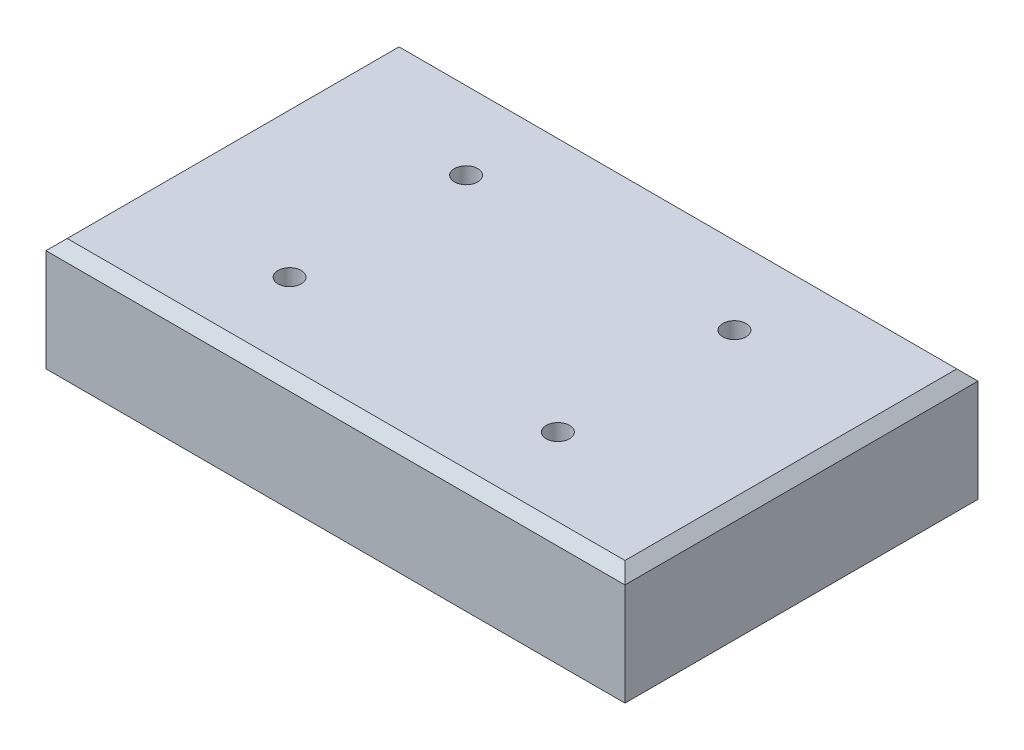
ISO-10303-21;
HEADER;
FILE_DESCRIPTION(('STEP AP214'),'2;1');
FILE_NAME('part.step','',(''),(''),'','','');
FILE_SCHEMA(('AUTOMOTIVE_DESIGN { 1 0 10303 214 1 1 1 1 }'));
ENDSEC;
DATA;
#1=APPLICATION_CONTEXT('core data for automotive mechanical design processes');
#2=APPLICATION_PROTOCOL_DEFINITION('international standard','automotive_design',2000,#1);
#3=PRODUCT_CONTEXT('',#1,'mechanical');
#4=PRODUCT('Part','Part','',(#3));
#5=PRODUCT_RELATED_PRODUCT_CATEGORY('part','',(#4));
#6=PRODUCT_DEFINITION_FORMATION('','',#4);
#7=PRODUCT_DEFINITION_CONTEXT('part definition',#1,'design');
#8=PRODUCT_DEFINITION('design','',#6,#7);
#9=PRODUCT_DEFINITION_SHAPE('','',#8);
#10=(LENGTH_UNIT() NAMED_UNIT(*) SI_UNIT(.MILLI.,.METRE.));
#11=(NAMED_UNIT(*) PLANE_ANGLE_UNIT() SI_UNIT($,.RADIAN.));
#12=(NAMED_UNIT(*) SI_UNIT($,.STERADIAN.) SOLID_ANGLE_UNIT());
#13=UNCERTAINTY_MEASURE_WITH_UNIT(LENGTH_MEASURE(1.E-05),#10,'distance_accuracy_value','');
#14=(GEOMETRIC_REPRESENTATION_CONTEXT(3) GLOBAL_UNCERTAINTY_ASSIGNED_CONTEXT((#13)) GLOBAL_UNIT_ASSIGNED_CONTEXT((#10,
#11,#12)) REPRESENTATION_CONTEXT('',''));
#15=CARTESIAN_POINT('',(0.,0.,0.));
#16=DIRECTION('',(0.,0.,1.));
#17=DIRECTION('',(1.,0.,0.));
#18=AXIS2_PLACEMENT_3D('',#15,#16,#17);
#19=CARTESIAN_POINT('',(41.,16.,-25.));
#20=DIRECTION('',(-1.,0.,0.));
#21=DIRECTION('',(0.,0.,1.));
#22=AXIS2_PLACEMENT_3D('',#19,#20,#21);
#23=PLANE('',#22);
#24=DIRECTION('',(0.,-1.,0.));
#25=VECTOR('',#24,1.);
#26=CARTESIAN_POINT('',(41.,16.,-25.));
#27=LINE('',#26,#25);
#28=CARTESIAN_POINT('',(41.,14.5,-25.));
#29=VERTEX_POINT('',#28);
#30=CARTESIAN_POINT('',(41.,0.,-25.));
#31=VERTEX_POINT('',#30);
#32=EDGE_CURVE('E166',#29,#31,#27,.T.);
#33=ORIENTED_EDGE('',*,*,#32,.F.);
#34=DIRECTION('',(0.,0.,1.));
#35=VECTOR('',#34,1.);
#36=CARTESIAN_POINT('',(41.,14.5,25.));
#37=LINE('',#36,#35);
#38=CARTESIAN_POINT('',(41.,14.5,25.));
#39=VERTEX_POINT('',#38);
#40=EDGE_CURVE('E60',#29,#39,#37,.T.);
#41=ORIENTED_EDGE('',*,*,#40,.T.);
#42=DIRECTION('',(0.,-1.,0.));
#43=VECTOR('',#42,1.);
#44=CARTESIAN_POINT('',(41.,16.,25.));
#45=LINE('',#44,#43);
#46=CARTESIAN_POINT('',(41.,0.,25.));
#47=VERTEX_POINT('',#46);
#48=EDGE_CURVE('E160',#39,#47,#45,.T.);
#49=ORIENTED_EDGE('',*,*,#48,.T.);
#50=DIRECTION('',(0.,0.,-1.));
#51=VECTOR('',#50,1.);
#52=CARTESIAN_POINT('',(41.,0.,-25.));
#53=LINE('',#52,#51);
#54=EDGE_CURVE('E148',#47,#31,#53,.T.);
#55=ORIENTED_EDGE('',*,*,#54,.T.);
#56=EDGE_LOOP('',(#33,#41,#49,#55));
#57=FACE_BOUND('',#56,.T.);
#58=ADVANCED_FACE('F50',(#57),#23,.F.);
#59=CARTESIAN_POINT('',(-41.,16.,-25.));
#60=DIRECTION('',(0.,0.,1.));
#61=DIRECTION('',(1.,0.,0.));
#62=AXIS2_PLACEMENT_3D('',#59,#60,#61);
#63=PLANE('',#62);
#64=DIRECTION('',(0.,-1.,0.));
#65=VECTOR('',#64,1.);
#66=CARTESIAN_POINT('',(-41.,16.,-25.));
#67=LINE('',#66,#65);
#68=CARTESIAN_POINT('',(-41.,14.5,-25.));
#69=VERTEX_POINT('',#68);
#70=CARTESIAN_POINT('',(-41.,0.,-25.));
#71=VERTEX_POINT('',#70);
#72=EDGE_CURVE('E164',#69,#71,#67,.T.);
#73=ORIENTED_EDGE('',*,*,#72,.F.);
#74=DIRECTION('',(1.,0.,0.));
#75=VECTOR('',#74,1.);
#76=CARTESIAN_POINT('',(41.,14.5,-25.));
#77=LINE('',#76,#75);
#78=EDGE_CURVE('E75',#69,#29,#77,.T.);
#79=ORIENTED_EDGE('',*,*,#78,.T.);
#80=ORIENTED_EDGE('',*,*,#32,.T.);
#81=DIRECTION('',(-1.,0.,0.));
#82=VECTOR('',#81,1.);
#83=CARTESIAN_POINT('',(-41.,0.,-25.));
#84=LINE('',#83,#82);
#85=EDGE_CURVE('E151',#31,#71,#84,.T.);
#86=ORIENTED_EDGE('',*,*,#85,.T.);
#87=EDGE_LOOP('',(#73,#79,#80,#86));
#88=FACE_BOUND('',#87,.T.);
#89=ADVANCED_FACE('F244',(#88),#63,.F.);
#90=CARTESIAN_POINT('',(-41.,16.,-25.));
#91=DIRECTION('',(1.,0.,0.));
#92=DIRECTION('',(0.,0.,-1.));
#93=AXIS2_PLACEMENT_3D('',#90,#91,#92);
#94=PLANE('',#93);
#95=DIRECTION('',(0.,-1.,0.));
#96=VECTOR('',#95,1.);
#97=CARTESIAN_POINT('',(-41.,16.,25.));
#98=LINE('',#97,#96);
#99=CARTESIAN_POINT('',(-41.,14.5,25.));
#100=VERTEX_POINT('',#99);
#101=CARTESIAN_POINT('',(-41.,0.,25.));
#102=VERTEX_POINT('',#101);
#103=EDGE_CURVE('E162',#100,#102,#98,.T.);
#104=ORIENTED_EDGE('',*,*,#103,.F.);
#105=DIRECTION('',(0.,0.,-1.));
#106=VECTOR('',#105,1.);
#107=CARTESIAN_POINT('',(-41.,14.5,-25.));
#108=LINE('',#107,#106);
#109=EDGE_CURVE('E177',#100,#69,#108,.T.);
#110=ORIENTED_EDGE('',*,*,#109,.T.);
#111=ORIENTED_EDGE('',*,*,#72,.T.);
#112=DIRECTION('',(0.,0.,1.));
#113=VECTOR('',#112,1.);
#114=CARTESIAN_POINT('',(-41.,0.,-25.));
#115=LINE('',#114,#113);
#116=EDGE_CURVE('E154',#71,#102,#115,.T.);
#117=ORIENTED_EDGE('',*,*,#116,.T.);
#118=EDGE_LOOP('',(#104,#110,#111,#117));
#119=FACE_BOUND('',#118,.T.);
#120=ADVANCED_FACE('F206',(#119),#94,.F.);
#121=CARTESIAN_POINT('',(-41.,16.,25.));
#122=DIRECTION('',(0.,0.,-1.));
#123=DIRECTION('',(-1.,0.,0.));
#124=AXIS2_PLACEMENT_3D('',#121,#122,#123);
#125=PLANE('',#124);
#126=ORIENTED_EDGE('',*,*,#48,.F.);
#127=DIRECTION('',(-1.,0.,0.));
#128=VECTOR('',#127,1.);
#129=CARTESIAN_POINT('',(-41.,14.5,25.));
#130=LINE('',#129,#128);
#131=EDGE_CURVE('E11',#39,#100,#130,.T.);
#132=ORIENTED_EDGE('',*,*,#131,.T.);
#133=ORIENTED_EDGE('',*,*,#103,.T.);
#134=DIRECTION('',(1.,0.,0.));
#135=VECTOR('',#134,1.);
#136=CARTESIAN_POINT('',(-41.,0.,25.));
#137=LINE('',#136,#135);
#138=EDGE_CURVE('E157',#102,#47,#137,.T.);
#139=ORIENTED_EDGE('',*,*,#138,.T.);
#140=EDGE_LOOP('',(#126,#132,#133,#139));
#141=FACE_BOUND('',#140,.T.);
#142=ADVANCED_FACE('F203',(#141),#125,.F.);
#143=CARTESIAN_POINT('',(0.,16.,0.));
#144=DIRECTION('',(0.,1.,0.));
#145=DIRECTION('',(0.,0.,1.));
#146=AXIS2_PLACEMENT_3D('',#143,#144,#145);
#147=PLANE('',#146);
#148=DIRECTION('',(-1.,0.,0.));
#149=VECTOR('',#148,1.);
#150=CARTESIAN_POINT('',(-41.,16.,-23.5));
#151=LINE('',#150,#149);
#152=CARTESIAN_POINT('',(39.5,16.,-23.5));
#153=VERTEX_POINT('',#152);
#154=CARTESIAN_POINT('',(-39.5,16.,-23.5));
#155=VERTEX_POINT('',#154);
#156=EDGE_CURVE('E172',#153,#155,#151,.T.);
#157=ORIENTED_EDGE('',*,*,#156,.T.);
#158=DIRECTION('',(0.,0.,1.));
#159=VECTOR('',#158,1.);
#160=CARTESIAN_POINT('',(-39.5,16.,25.));
#161=LINE('',#160,#159);
#162=CARTESIAN_POINT('',(-39.5,16.,23.5));
#163=VERTEX_POINT('',#162);
#164=EDGE_CURVE('E174',#155,#163,#161,.T.);
#165=ORIENTED_EDGE('',*,*,#164,.T.);
#166=DIRECTION('',(1.,0.,0.));
#167=VECTOR('',#166,1.);
#168=CARTESIAN_POINT('',(41.,16.,23.5));
#169=LINE('',#168,#167);
#170=CARTESIAN_POINT('',(39.5,16.,23.5));
#171=VERTEX_POINT('',#170);
#172=EDGE_CURVE('E168',#163,#171,#169,.T.);
#173=ORIENTED_EDGE('',*,*,#172,.T.);
#174=DIRECTION('',(0.,0.,-1.));
#175=VECTOR('',#174,1.);
#176=CARTESIAN_POINT('',(39.5,16.,-25.));
#177=LINE('',#176,#175);
#178=EDGE_CURVE('E170',#171,#153,#177,.T.);
#179=ORIENTED_EDGE('',*,*,#178,.T.);
#180=EDGE_LOOP('',(#157,#165,#173,#179));
#181=FACE_BOUND('',#180,.T.);
#182=CARTESIAN_POINT('',(-19.,16.,-12.5));
#183=DIRECTION('',(0.,1.,0.));
#184=DIRECTION('',(0.,0.,1.));
#185=AXIS2_PLACEMENT_3D('',#182,#183,#184);
#186=CIRCLE('',#185,1.65);
#187=CARTESIAN_POINT('',(-19.,16.,-10.85));
#188=VERTEX_POINT('',#187);
#189=EDGE_CURVE('E126',#188,#188,#186,.T.);
#190=ORIENTED_EDGE('',*,*,#189,.F.);
#191=EDGE_LOOP('',(#190));
#192=FACE_BOUND('',#191,.T.);
#193=CARTESIAN_POINT('',(19.,16.,-12.5));
#194=DIRECTION('',(0.,1.,0.));
#195=DIRECTION('',(0.,0.,1.));
#196=AXIS2_PLACEMENT_3D('',#193,#194,#195);
#197=CIRCLE('',#196,1.65);
#198=CARTESIAN_POINT('',(19.,16.,-10.85));
#199=VERTEX_POINT('',#198);
#200=EDGE_CURVE('E125',#199,#199,#197,.T.);
#201=ORIENTED_EDGE('',*,*,#200,.F.);
#202=EDGE_LOOP('',(#201));
#203=FACE_BOUND('',#202,.T.);
#204=CARTESIAN_POINT('',(19.,16.,12.5));
#205=DIRECTION('',(0.,1.,0.));
#206=DIRECTION('',(0.,0.,1.));
#207=AXIS2_PLACEMENT_3D('',#204,#205,#206);
#208=CIRCLE('',#207,1.65);
#209=CARTESIAN_POINT('',(19.,16.,14.15));
#210=VERTEX_POINT('',#209);
#211=EDGE_CURVE('E136',#210,#210,#208,.T.);
#212=ORIENTED_EDGE('',*,*,#211,.F.);
#213=EDGE_LOOP('',(#212));
#214=FACE_BOUND('',#213,.T.);
#215=CARTESIAN_POINT('',(-19.,16.,12.5));
#216=DIRECTION('',(0.,1.,0.));
#217=DIRECTION('',(0.,0.,1.));
#218=AXIS2_PLACEMENT_3D('',#215,#216,#217);
#219=CIRCLE('',#218,1.65);
#220=CARTESIAN_POINT('',(-19.,16.,14.15));
#221=VERTEX_POINT('',#220);
#222=EDGE_CURVE('E142',#221,#221,#219,.T.);
#223=ORIENTED_EDGE('',*,*,#222,.F.);
#224=EDGE_LOOP('',(#223));
#225=FACE_BOUND('',#224,.T.);
#226=ADVANCED_FACE('F213',(#181,#192,#203,#214,#225),#147,.T.);
#227=CARTESIAN_POINT('',(0.,0.,0.));
#228=DIRECTION('',(0.,1.,0.));
#229=DIRECTION('',(0.,0.,1.));
#230=AXIS2_PLACEMENT_3D('',#227,#228,#229);
#231=PLANE('',#230);
#232=ORIENTED_EDGE('',*,*,#54,.F.);
#233=ORIENTED_EDGE('',*,*,#138,.F.);
#234=ORIENTED_EDGE('',*,*,#116,.F.);
#235=ORIENTED_EDGE('',*,*,#85,.F.);
#236=EDGE_LOOP('',(#232,#233,#234,#235));
#237=FACE_BOUND('',#236,.T.);
#238=ADVANCED_FACE('F216',(#237),#231,.F.);
#239=CARTESIAN_POINT('',(-19.,8.99142002139548,12.5));
#240=DIRECTION('',(0.,1.,0.));
#241=DIRECTION('',(0.,0.,1.));
#242=AXIS2_PLACEMENT_3D('',#239,#240,#241);
#243=CONICAL_SURFACE('',#242,1.65,1.02974425867665);
#244=CARTESIAN_POINT('',(-19.,8.,12.5));
#245=VERTEX_POINT('',#244);
#246=VERTEX_LOOP('',#245);
#247=FACE_BOUND('',#246,.T.);
#248=CARTESIAN_POINT('',(-19.,8.99142002139548,12.5));
#249=DIRECTION('',(0.,1.,0.));
#250=DIRECTION('',(0.,0.,1.));
#251=AXIS2_PLACEMENT_3D('',#248,#249,#250);
#252=CIRCLE('',#251,1.65);
#253=CARTESIAN_POINT('',(-19.,8.99142002139548,14.15));
#254=VERTEX_POINT('',#253);
#255=EDGE_CURVE('E145',#254,#254,#252,.T.);
#256=ORIENTED_EDGE('',*,*,#255,.T.);
#257=EDGE_LOOP('',(#256));
#258=FACE_BOUND('',#257,.T.);
#259=ADVANCED_FACE('F229',(#247,#258),#243,.F.);
#260=CARTESIAN_POINT('',(-19.,16.,12.5));
#261=DIRECTION('',(0.,1.,0.));
#262=DIRECTION('',(0.,0.,1.));
#263=AXIS2_PLACEMENT_3D('',#260,#261,#262);
#264=CYLINDRICAL_SURFACE('',#263,1.65);
#265=ORIENTED_EDGE('',*,*,#255,.F.);
#266=EDGE_LOOP('',(#265));
#267=FACE_BOUND('',#266,.T.);
#268=ORIENTED_EDGE('',*,*,#222,.T.);
#269=EDGE_LOOP('',(#268));
#270=FACE_BOUND('',#269,.T.);
#271=ADVANCED_FACE('F226',(#267,#270),#264,.F.);
#272=CARTESIAN_POINT('',(19.,8.99142002139548,12.5));
#273=DIRECTION('',(0.,1.,0.));
#274=DIRECTION('',(0.,0.,1.));
#275=AXIS2_PLACEMENT_3D('',#272,#273,#274);
#276=CONICAL_SURFACE('',#275,1.65,1.02974425867665);
#277=CARTESIAN_POINT('',(19.,8.,12.5));
#278=VERTEX_POINT('',#277);
#279=VERTEX_LOOP('',#278);
#280=FACE_BOUND('',#279,.T.);
#281=CARTESIAN_POINT('',(19.,8.99142002139548,12.5));
#282=DIRECTION('',(0.,1.,0.));
#283=DIRECTION('',(0.,0.,1.));
#284=AXIS2_PLACEMENT_3D('',#281,#282,#283);
#285=CIRCLE('',#284,1.65);
#286=CARTESIAN_POINT('',(19.,8.99142002139548,14.15));
#287=VERTEX_POINT('',#286);
#288=EDGE_CURVE('E139',#287,#287,#285,.T.);
#289=ORIENTED_EDGE('',*,*,#288,.T.);
#290=EDGE_LOOP('',(#289));
#291=FACE_BOUND('',#290,.T.);
#292=ADVANCED_FACE('F228',(#280,#291),#276,.F.);
#293=CARTESIAN_POINT('',(19.,16.,12.5));
#294=DIRECTION('',(0.,1.,0.));
#295=DIRECTION('',(0.,0.,1.));
#296=AXIS2_PLACEMENT_3D('',#293,#294,#295);
#297=CYLINDRICAL_SURFACE('',#296,1.65);
#298=ORIENTED_EDGE('',*,*,#288,.F.);
#299=EDGE_LOOP('',(#298));
#300=FACE_BOUND('',#299,.T.);
#301=ORIENTED_EDGE('',*,*,#211,.T.);
#302=EDGE_LOOP('',(#301));
#303=FACE_BOUND('',#302,.T.);
#304=ADVANCED_FACE('F236',(#300,#303),#297,.F.);
#305=CARTESIAN_POINT('',(19.,8.99142002139548,-12.5));
#306=DIRECTION('',(0.,1.,0.));
#307=DIRECTION('',(0.,0.,1.));
#308=AXIS2_PLACEMENT_3D('',#305,#306,#307);
#309=CONICAL_SURFACE('',#308,1.65,1.02974425867665);
#310=CARTESIAN_POINT('',(19.,8.,-12.5));
#311=VERTEX_POINT('',#310);
#312=VERTEX_LOOP('',#311);
#313=FACE_BOUND('',#312,.T.);
#314=CARTESIAN_POINT('',(19.,8.99142002139548,-12.5));
#315=DIRECTION('',(0.,1.,0.));
#316=DIRECTION('',(0.,0.,1.));
#317=AXIS2_PLACEMENT_3D('',#314,#315,#316);
#318=CIRCLE('',#317,1.65);
#319=CARTESIAN_POINT('',(19.,8.99142002139548,-10.85));
#320=VERTEX_POINT('',#319);
#321=EDGE_CURVE('E129',#320,#320,#318,.T.);
#322=ORIENTED_EDGE('',*,*,#321,.T.);
#323=EDGE_LOOP('',(#322));
#324=FACE_BOUND('',#323,.T.);
#325=ADVANCED_FACE('F279',(#313,#324),#309,.F.);
#326=CARTESIAN_POINT('',(19.,16.,-12.5));
#327=DIRECTION('',(0.,1.,0.));
#328=DIRECTION('',(0.,0.,1.));
#329=AXIS2_PLACEMENT_3D('',#326,#327,#328);
#330=CYLINDRICAL_SURFACE('',#329,1.65);
#331=ORIENTED_EDGE('',*,*,#321,.F.);
#332=EDGE_LOOP('',(#331));
#333=FACE_BOUND('',#332,.T.);
#334=ORIENTED_EDGE('',*,*,#200,.T.);
#335=EDGE_LOOP('',(#334));
#336=FACE_BOUND('',#335,.T.);
#337=ADVANCED_FACE('F119',(#333,#336),#330,.F.);
#338=CARTESIAN_POINT('',(-19.,8.99142002139548,-12.5));
#339=DIRECTION('',(0.,1.,0.));
#340=DIRECTION('',(0.,0.,1.));
#341=AXIS2_PLACEMENT_3D('',#338,#339,#340);
#342=CONICAL_SURFACE('',#341,1.65,1.02974425867665);
#343=CARTESIAN_POINT('',(-19.,8.,-12.5));
#344=VERTEX_POINT('',#343);
#345=VERTEX_LOOP('',#344);
#346=FACE_BOUND('',#345,.T.);
#347=CARTESIAN_POINT('',(-19.,8.99142002139548,-12.5));
#348=DIRECTION('',(0.,1.,0.));
#349=DIRECTION('',(0.,0.,1.));
#350=AXIS2_PLACEMENT_3D('',#347,#348,#349);
#351=CIRCLE('',#350,1.65);
#352=CARTESIAN_POINT('',(-19.,8.99142002139548,-10.85));
#353=VERTEX_POINT('',#352);
#354=EDGE_CURVE('E123',#353,#353,#351,.T.);
#355=ORIENTED_EDGE('',*,*,#354,.T.);
#356=EDGE_LOOP('',(#355));
#357=FACE_BOUND('',#356,.T.);
#358=ADVANCED_FACE('F115',(#346,#357),#342,.F.);
#359=CARTESIAN_POINT('',(-19.,16.,-12.5));
#360=DIRECTION('',(0.,1.,0.));
#361=DIRECTION('',(0.,0.,1.));
#362=AXIS2_PLACEMENT_3D('',#359,#360,#361);
#363=CYLINDRICAL_SURFACE('',#362,1.65);
#364=ORIENTED_EDGE('',*,*,#354,.F.);
#365=EDGE_LOOP('',(#364));
#366=FACE_BOUND('',#365,.T.);
#367=ORIENTED_EDGE('',*,*,#189,.T.);
#368=EDGE_LOOP('',(#367));
#369=FACE_BOUND('',#368,.T.);
#370=ADVANCED_FACE('F118',(#366,#369),#363,.F.);
#371=CARTESIAN_POINT('',(39.5,16.,0.));
#372=DIRECTION('',(0.707106781186551,0.707106781186544,0.));
#373=DIRECTION('',(0.,0.,1.));
#374=AXIS2_PLACEMENT_3D('',#371,#372,#373);
#375=PLANE('',#374);
#376=DIRECTION('',(-0.577350269189624,0.577350269189629,-0.577350269189624));
#377=VECTOR('',#376,1.);
#378=CARTESIAN_POINT('',(26.3333333333334,29.1666666666667,10.3333333333334));
#379=LINE('',#378,#377);
#380=EDGE_CURVE('E185',#39,#171,#379,.T.);
#381=ORIENTED_EDGE('',*,*,#380,.F.);
#382=ORIENTED_EDGE('',*,*,#40,.F.);
#383=DIRECTION('',(-0.577350269189624,0.577350269189629,0.577350269189624));
#384=VECTOR('',#383,1.);
#385=CARTESIAN_POINT('',(31.6666666666667,23.8333333333334,-15.6666666666667));
#386=LINE('',#385,#384);
#387=EDGE_CURVE('E55',#153,#29,#386,.F.);
#388=ORIENTED_EDGE('',*,*,#387,.F.);
#389=ORIENTED_EDGE('',*,*,#178,.F.);
#390=EDGE_LOOP('',(#381,#382,#388,#389));
#391=FACE_BOUND('',#390,.T.);
#392=ADVANCED_FACE('F53',(#391),#375,.T.);
#393=CARTESIAN_POINT('',(0.,16.,-23.5));
#394=DIRECTION('',(0.,0.707106781186544,-0.707106781186551));
#395=DIRECTION('',(1.,0.,0.));
#396=AXIS2_PLACEMENT_3D('',#393,#394,#395);
#397=PLANE('',#396);
#398=ORIENTED_EDGE('',*,*,#387,.T.);
#399=ORIENTED_EDGE('',*,*,#78,.F.);
#400=DIRECTION('',(0.577350269189625,0.577350269189629,0.577350269189623));
#401=VECTOR('',#400,1.);
#402=CARTESIAN_POINT('',(-26.3333333333334,29.1666666666667,-10.3333333333334));
#403=LINE('',#402,#401);
#404=EDGE_CURVE('E184',#155,#69,#403,.F.);
#405=ORIENTED_EDGE('',*,*,#404,.F.);
#406=ORIENTED_EDGE('',*,*,#156,.F.);
#407=EDGE_LOOP('',(#398,#399,#405,#406));
#408=FACE_BOUND('',#407,.T.);
#409=ADVANCED_FACE('F195',(#408),#397,.T.);
#410=CARTESIAN_POINT('',(0.,16.,23.5));
#411=DIRECTION('',(0.,0.707106781186544,0.707106781186551));
#412=DIRECTION('',(-1.,0.,0.));
#413=AXIS2_PLACEMENT_3D('',#410,#411,#412);
#414=PLANE('',#413);
#415=ORIENTED_EDGE('',*,*,#380,.T.);
#416=ORIENTED_EDGE('',*,*,#172,.F.);
#417=DIRECTION('',(-0.577350269189625,-0.577350269189629,0.577350269189624));
#418=VECTOR('',#417,1.);
#419=CARTESIAN_POINT('',(-26.3333333333334,29.1666666666667,10.3333333333334));
#420=LINE('',#419,#418);
#421=EDGE_CURVE('E182',#100,#163,#420,.F.);
#422=ORIENTED_EDGE('',*,*,#421,.F.);
#423=ORIENTED_EDGE('',*,*,#131,.F.);
#424=EDGE_LOOP('',(#415,#416,#422,#423));
#425=FACE_BOUND('',#424,.T.);
#426=ADVANCED_FACE('F200',(#425),#414,.T.);
#427=CARTESIAN_POINT('',(-39.5,16.,0.));
#428=DIRECTION('',(-0.70710678118655,0.707106781186545,0.));
#429=DIRECTION('',(0.,0.,-1.));
#430=AXIS2_PLACEMENT_3D('',#427,#428,#429);
#431=PLANE('',#430);
#432=ORIENTED_EDGE('',*,*,#404,.T.);
#433=ORIENTED_EDGE('',*,*,#109,.F.);
#434=ORIENTED_EDGE('',*,*,#421,.T.);
#435=ORIENTED_EDGE('',*,*,#164,.F.);
#436=EDGE_LOOP('',(#432,#433,#434,#435));
#437=FACE_BOUND('',#436,.T.);
#438=ADVANCED_FACE('F210',(#437),#431,.T.);
#439=CLOSED_SHELL('',(#58,#89,#120,#142,#226,#238,#259,#271,#292,#304,#325,#337,#358,#370,#392,
#409,#426,#438));
#440=MANIFOLD_SOLID_BREP('B2',#439);
#441=ADVANCED_BREP_SHAPE_REPRESENTATION('',(#18,#440),#14);
#442=SHAPE_DEFINITION_REPRESENTATION(#9,#441);
ENDSEC;
END-ISO-10303-21;
